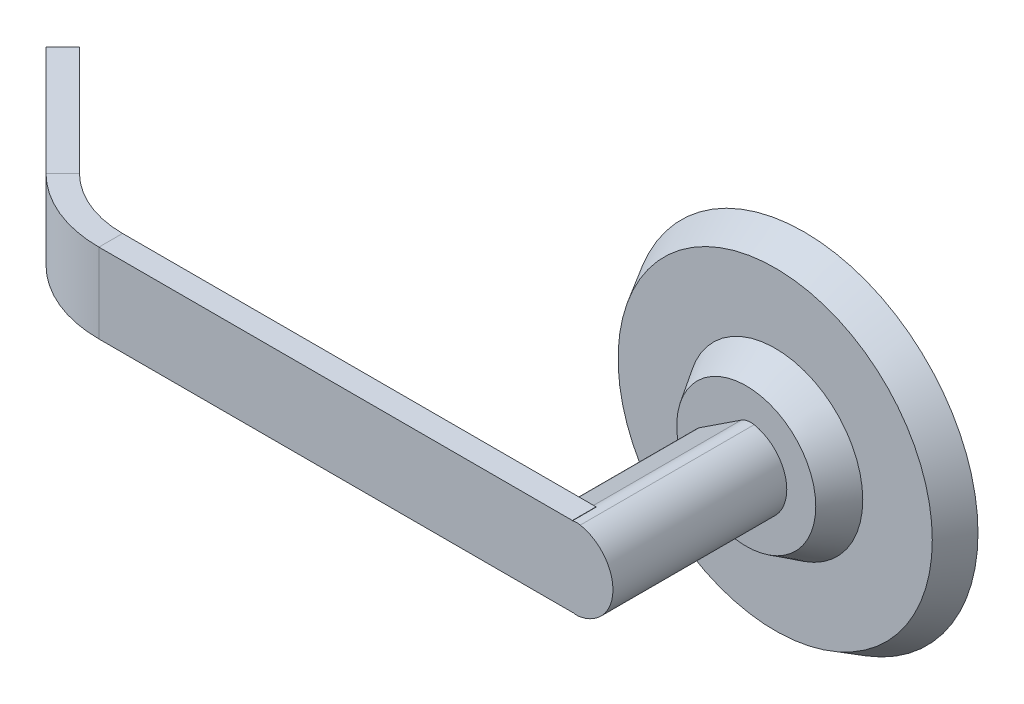
ISO-10303-21;
HEADER;
FILE_DESCRIPTION(('STEP AP214'),'2;1');
FILE_NAME('part.step','',(''),(''),'','','');
FILE_SCHEMA(('AUTOMOTIVE_DESIGN { 1 0 10303 214 1 1 1 1 }'));
ENDSEC;
DATA;
#1=APPLICATION_CONTEXT('core data for automotive mechanical design processes');
#2=APPLICATION_PROTOCOL_DEFINITION('international standard','automotive_design',2000,#1);
#3=PRODUCT_CONTEXT('',#1,'mechanical');
#4=PRODUCT('Part','Part','',(#3));
#5=PRODUCT_RELATED_PRODUCT_CATEGORY('part','',(#4));
#6=PRODUCT_DEFINITION_FORMATION('','',#4);
#7=PRODUCT_DEFINITION_CONTEXT('part definition',#1,'design');
#8=PRODUCT_DEFINITION('design','',#6,#7);
#9=PRODUCT_DEFINITION_SHAPE('','',#8);
#10=(LENGTH_UNIT() NAMED_UNIT(*) SI_UNIT(.MILLI.,.METRE.));
#11=(NAMED_UNIT(*) PLANE_ANGLE_UNIT() SI_UNIT($,.RADIAN.));
#12=(NAMED_UNIT(*) SI_UNIT($,.STERADIAN.) SOLID_ANGLE_UNIT());
#13=UNCERTAINTY_MEASURE_WITH_UNIT(LENGTH_MEASURE(1.E-05),#10,'distance_accuracy_value','');
#14=(GEOMETRIC_REPRESENTATION_CONTEXT(3) GLOBAL_UNCERTAINTY_ASSIGNED_CONTEXT((#13)) GLOBAL_UNIT_ASSIGNED_CONTEXT((#10,
#11,#12)) REPRESENTATION_CONTEXT('',''));
#15=CARTESIAN_POINT('',(0.,0.,0.));
#16=DIRECTION('',(0.,0.,1.));
#17=DIRECTION('',(1.,0.,0.));
#18=AXIS2_PLACEMENT_3D('',#15,#16,#17);
#19=CARTESIAN_POINT('',(-8.89,0.,38.1));
#20=DIRECTION('',(0.,0.,-1.));
#21=DIRECTION('',(-1.,0.,0.));
#22=AXIS2_PLACEMENT_3D('',#19,#20,#21);
#23=CYLINDRICAL_SURFACE('',#22,2.54);
#24=DIRECTION('',(0.,0.,-1.));
#25=VECTOR('',#24,1.);
#26=CARTESIAN_POINT('',(-10.2861581196911,-2.12187240540536,38.1));
#27=LINE('',#26,#25);
#28=CARTESIAN_POINT('',(-10.2861581196911,-2.12187240540536,32.9143260542168));
#29=VERTEX_POINT('',#28);
#30=CARTESIAN_POINT('',(-10.2861581196911,-2.12187240540536,0.));
#31=VERTEX_POINT('',#30);
#32=EDGE_CURVE('E293',#29,#31,#27,.T.);
#33=ORIENTED_EDGE('',*,*,#32,.F.);
#34=CARTESIAN_POINT('',(-8.89,0.,32.9143260542168));
#35=DIRECTION('',(0.,0.,1.));
#36=DIRECTION('',(1.,0.,0.));
#37=AXIS2_PLACEMENT_3D('',#34,#35,#36);
#38=CIRCLE('',#37,2.54);
#39=CARTESIAN_POINT('',(-10.2861581196911,2.12187240540536,32.9143260542168));
#40=VERTEX_POINT('',#39);
#41=EDGE_CURVE('E264',#29,#40,#38,.F.);
#42=ORIENTED_EDGE('',*,*,#41,.T.);
#43=DIRECTION('',(0.,0.,-1.));
#44=VECTOR('',#43,1.);
#45=CARTESIAN_POINT('',(-10.2861581196911,2.12187240540536,38.1));
#46=LINE('',#45,#44);
#47=CARTESIAN_POINT('',(-10.2861581196911,2.12187240540536,0.));
#48=VERTEX_POINT('',#47);
#49=EDGE_CURVE('E278',#40,#48,#46,.T.);
#50=ORIENTED_EDGE('',*,*,#49,.T.);
#51=CARTESIAN_POINT('',(-8.89,0.,0.));
#52=DIRECTION('',(0.,0.,-1.));
#53=DIRECTION('',(-1.,0.,0.));
#54=AXIS2_PLACEMENT_3D('',#51,#52,#53);
#55=CIRCLE('',#54,2.54);
#56=EDGE_CURVE('E270',#31,#48,#55,.T.);
#57=ORIENTED_EDGE('',*,*,#56,.F.);
#58=EDGE_LOOP('',(#33,#42,#50,#57));
#59=FACE_BOUND('',#58,.T.);
#60=ADVANCED_FACE('F49',(#59),#23,.T.);
#61=CARTESIAN_POINT('',(-10.2861581196911,-2.12187240540536,38.1));
#62=DIRECTION('',(0.549668551059475,0.835382836773761,0.));
#63=DIRECTION('',(-0.835382836773761,0.549668551059475,0.));
#64=AXIS2_PLACEMENT_3D('',#61,#62,#63);
#65=PLANE('',#64);
#66=DIRECTION('',(0.835382836773761,-0.549668551059475,0.));
#67=VECTOR('',#66,1.);
#68=CARTESIAN_POINT('',(-10.2861581196911,-2.12187240540536,32.9143260542168));
#69=LINE('',#68,#67);
#70=CARTESIAN_POINT('',(-1.10192803762914,-8.16494896812268,32.9143260542168));
#71=VERTEX_POINT('',#70);
#72=EDGE_CURVE('E64',#29,#71,#69,.T.);
#73=ORIENTED_EDGE('',*,*,#72,.F.);
#74=ORIENTED_EDGE('',*,*,#32,.T.);
#75=DIRECTION('',(0.835382836773761,-0.549668551059475,0.));
#76=VECTOR('',#75,1.);
#77=CARTESIAN_POINT('',(-10.2861581196911,-2.12187240540536,0.));
#78=LINE('',#77,#76);
#79=CARTESIAN_POINT('',(-1.10192803762914,-8.16494896812268,0.));
#80=VERTEX_POINT('',#79);
#81=EDGE_CURVE('E273',#31,#80,#78,.T.);
#82=ORIENTED_EDGE('',*,*,#81,.T.);
#83=DIRECTION('',(0.,0.,-1.));
#84=VECTOR('',#83,1.);
#85=CARTESIAN_POINT('',(-1.10192803762914,-8.16494896812268,38.1));
#86=LINE('',#85,#84);
#87=EDGE_CURVE('E296',#71,#80,#86,.T.);
#88=ORIENTED_EDGE('',*,*,#87,.F.);
#89=EDGE_LOOP('',(#73,#74,#82,#88));
#90=FACE_BOUND('',#89,.T.);
#91=ADVANCED_FACE('F331',(#90),#65,.F.);
#92=CARTESIAN_POINT('',(-1.10192803762914,8.16494896812268,38.1));
#93=DIRECTION('',(0.549668551059475,-0.835382836773761,0.));
#94=DIRECTION('',(0.835382836773761,0.549668551059475,0.));
#95=AXIS2_PLACEMENT_3D('',#92,#93,#94);
#96=PLANE('',#95);
#97=DIRECTION('',(-0.835382836773761,-0.549668551059475,0.));
#98=VECTOR('',#97,1.);
#99=CARTESIAN_POINT('',(-1.10192803762914,8.16494896812268,32.9143260542168));
#100=LINE('',#99,#98);
#101=CARTESIAN_POINT('',(-1.10192803762914,8.16494896812268,32.9143260542168));
#102=VERTEX_POINT('',#101);
#103=EDGE_CURVE('E13',#102,#40,#100,.T.);
#104=ORIENTED_EDGE('',*,*,#103,.F.);
#105=DIRECTION('',(0.,0.,-1.));
#106=VECTOR('',#105,1.);
#107=CARTESIAN_POINT('',(-1.10192803762914,8.16494896812268,38.1));
#108=LINE('',#107,#106);
#109=CARTESIAN_POINT('',(-1.10192803762914,8.16494896812268,0.));
#110=VERTEX_POINT('',#109);
#111=EDGE_CURVE('E304',#102,#110,#108,.T.);
#112=ORIENTED_EDGE('',*,*,#111,.T.);
#113=DIRECTION('',(-0.835382836773762,-0.549668551059476,0.));
#114=VECTOR('',#113,1.);
#115=CARTESIAN_POINT('',(-1.10192803762914,8.16494896812268,0.));
#116=LINE('',#115,#114);
#117=EDGE_CURVE('E281',#110,#48,#116,.T.);
#118=ORIENTED_EDGE('',*,*,#117,.T.);
#119=ORIENTED_EDGE('',*,*,#49,.F.);
#120=EDGE_LOOP('',(#104,#112,#118,#119));
#121=FACE_BOUND('',#120,.T.);
#122=ADVANCED_FACE('F328',(#121),#96,.F.);
#123=CARTESIAN_POINT('',(15.24,0.,0.));
#124=DIRECTION('',(0.,0.,1.));
#125=DIRECTION('',(1.,0.,0.));
#126=AXIS2_PLACEMENT_3D('',#123,#124,#125);
#127=PLANE('',#126);
#128=CARTESIAN_POINT('',(0.,0.,0.));
#129=DIRECTION('',(0.,0.,1.));
#130=DIRECTION('',(1.,0.,0.));
#131=AXIS2_PLACEMENT_3D('',#128,#129,#130);
#132=CIRCLE('',#131,15.24);
#133=CARTESIAN_POINT('',(15.24,0.,0.));
#134=VERTEX_POINT('',#133);
#135=EDGE_CURVE('E295',#134,#134,#132,.T.);
#136=ORIENTED_EDGE('',*,*,#135,.T.);
#137=EDGE_LOOP('',(#136));
#138=FACE_BOUND('',#137,.T.);
#139=ORIENTED_EDGE('',*,*,#81,.F.);
#140=ORIENTED_EDGE('',*,*,#56,.T.);
#141=ORIENTED_EDGE('',*,*,#117,.F.);
#142=CARTESIAN_POINT('',(0.992309141907463,4.98214036001465,0.));
#143=DIRECTION('',(0.,0.,-1.));
#144=DIRECTION('',(-1.,0.,0.));
#145=AXIS2_PLACEMENT_3D('',#142,#143,#144);
#146=CIRCLE('',#145,3.81);
#147=CARTESIAN_POINT('',(1.73654099833806,8.71874563002563,0.));
#148=VERTEX_POINT('',#147);
#149=EDGE_CURVE('E284',#110,#148,#146,.T.);
#150=ORIENTED_EDGE('',*,*,#149,.T.);
#151=CARTESIAN_POINT('',(0.,0.,0.));
#152=DIRECTION('',(0.,0.,-1.));
#153=DIRECTION('',(-1.,0.,0.));
#154=AXIS2_PLACEMENT_3D('',#151,#152,#153);
#155=CIRCLE('',#154,8.89);
#156=CARTESIAN_POINT('',(1.73654099833806,-8.71874563002563,0.));
#157=VERTEX_POINT('',#156);
#158=EDGE_CURVE('E286',#148,#157,#155,.T.);
#159=ORIENTED_EDGE('',*,*,#158,.T.);
#160=CARTESIAN_POINT('',(0.992309141907464,-4.98214036001465,0.));
#161=DIRECTION('',(0.,0.,1.));
#162=DIRECTION('',(1.,0.,0.));
#163=AXIS2_PLACEMENT_3D('',#160,#161,#162);
#164=CIRCLE('',#163,3.81);
#165=EDGE_CURVE('E288',#80,#157,#164,.T.);
#166=ORIENTED_EDGE('',*,*,#165,.F.);
#167=EDGE_LOOP('',(#139,#140,#141,#150,#159,#166));
#168=FACE_BOUND('',#167,.T.);
#169=ADVANCED_FACE('F51',(#138,#168),#127,.T.);
#170=CARTESIAN_POINT('',(0.,0.,-12.7));
#171=DIRECTION('',(0.,0.,-1.));
#172=DIRECTION('',(-1.,0.,0.));
#173=AXIS2_PLACEMENT_3D('',#170,#171,#172);
#174=PLANE('',#173);
#175=CARTESIAN_POINT('',(0.,0.,-12.7));
#176=DIRECTION('',(0.,0.,1.));
#177=DIRECTION('',(1.,0.,0.));
#178=AXIS2_PLACEMENT_3D('',#175,#176,#177);
#179=CIRCLE('',#178,38.1);
#180=CARTESIAN_POINT('',(38.1,0.,-12.7));
#181=VERTEX_POINT('',#180);
#182=EDGE_CURVE('E57',#181,#181,#179,.T.);
#183=ORIENTED_EDGE('',*,*,#182,.F.);
#184=EDGE_LOOP('',(#183));
#185=FACE_BOUND('',#184,.T.);
#186=ADVANCED_FACE('F320',(#185),#174,.T.);
#187=CARTESIAN_POINT('',(0.,0.,-6.35));
#188=DIRECTION('',(0.,0.,-1.));
#189=DIRECTION('',(-1.,0.,0.));
#190=AXIS2_PLACEMENT_3D('',#187,#188,#189);
#191=CONICAL_SURFACE('',#190,34.4338257906459,0.523598775598297);
#192=ORIENTED_EDGE('',*,*,#182,.T.);
#193=EDGE_LOOP('',(#192));
#194=FACE_BOUND('',#193,.T.);
#195=CARTESIAN_POINT('',(0.,0.,-6.35));
#196=DIRECTION('',(0.,0.,1.));
#197=DIRECTION('',(1.,0.,0.));
#198=AXIS2_PLACEMENT_3D('',#195,#196,#197);
#199=CIRCLE('',#198,34.4338257906459);
#200=CARTESIAN_POINT('',(34.4338257906459,0.,-6.35));
#201=VERTEX_POINT('',#200);
#202=EDGE_CURVE('E312',#201,#201,#199,.T.);
#203=ORIENTED_EDGE('',*,*,#202,.F.);
#204=EDGE_LOOP('',(#203));
#205=FACE_BOUND('',#204,.T.);
#206=ADVANCED_FACE('F317',(#194,#205),#191,.T.);
#207=CARTESIAN_POINT('',(34.4338257906459,0.,-6.35));
#208=DIRECTION('',(0.,0.,1.));
#209=DIRECTION('',(1.,0.,0.));
#210=AXIS2_PLACEMENT_3D('',#207,#208,#209);
#211=PLANE('',#210);
#212=ORIENTED_EDGE('',*,*,#202,.T.);
#213=EDGE_LOOP('',(#212));
#214=FACE_BOUND('',#213,.T.);
#215=CARTESIAN_POINT('',(0.,0.,-6.35));
#216=DIRECTION('',(0.,0.,1.));
#217=DIRECTION('',(1.,0.,0.));
#218=AXIS2_PLACEMENT_3D('',#215,#216,#217);
#219=CIRCLE('',#218,19.1938257906459);
#220=CARTESIAN_POINT('',(19.1938257906459,0.,-6.35));
#221=VERTEX_POINT('',#220);
#222=EDGE_CURVE('E309',#221,#221,#219,.T.);
#223=ORIENTED_EDGE('',*,*,#222,.F.);
#224=EDGE_LOOP('',(#223));
#225=FACE_BOUND('',#224,.T.);
#226=ADVANCED_FACE('F326',(#214,#225),#211,.T.);
#227=CARTESIAN_POINT('',(0.,0.,0.));
#228=DIRECTION('',(0.,0.,-1.));
#229=DIRECTION('',(-1.,0.,0.));
#230=AXIS2_PLACEMENT_3D('',#227,#228,#229);
#231=CONICAL_SURFACE('',#230,15.24,0.556907448621021);
#232=ORIENTED_EDGE('',*,*,#222,.T.);
#233=EDGE_LOOP('',(#232));
#234=FACE_BOUND('',#233,.T.);
#235=ORIENTED_EDGE('',*,*,#135,.F.);
#236=EDGE_LOOP('',(#235));
#237=FACE_BOUND('',#236,.T.);
#238=ADVANCED_FACE('F341',(#234,#237),#231,.T.);
#239=CARTESIAN_POINT('',(0.992309141907464,-4.98214036001465,38.1));
#240=DIRECTION('',(0.,0.,-1.));
#241=DIRECTION('',(-1.,0.,0.));
#242=AXIS2_PLACEMENT_3D('',#239,#240,#241);
#243=CYLINDRICAL_SURFACE('',#242,3.81);
#244=CARTESIAN_POINT('',(0.992309141907464,-4.98214036001465,38.1));
#245=DIRECTION('',(0.,0.,1.));
#246=DIRECTION('',(1.,0.,0.));
#247=AXIS2_PLACEMENT_3D('',#244,#245,#246);
#248=CIRCLE('',#247,3.81);
#249=CARTESIAN_POINT('',(0.,-8.66064855857651,38.1));
#250=VERTEX_POINT('',#249);
#251=CARTESIAN_POINT('',(1.73654099833806,-8.71874563002563,38.1));
#252=VERTEX_POINT('',#251);
#253=EDGE_CURVE('E276',#250,#252,#248,.T.);
#254=ORIENTED_EDGE('',*,*,#253,.F.);
#255=DIRECTION('',(0.,0.,-1.));
#256=VECTOR('',#255,1.);
#257=CARTESIAN_POINT('',(0.,-8.66064855857651,38.1));
#258=LINE('',#257,#256);
#259=CARTESIAN_POINT('',(0.,-8.66064855857651,32.9143260542168));
#260=VERTEX_POINT('',#259);
#261=EDGE_CURVE('E72',#250,#260,#258,.T.);
#262=ORIENTED_EDGE('',*,*,#261,.T.);
#263=CARTESIAN_POINT('',(0.992309141907464,-4.98214036001465,32.9143260542168));
#264=DIRECTION('',(0.,0.,1.));
#265=DIRECTION('',(1.,0.,0.));
#266=AXIS2_PLACEMENT_3D('',#263,#264,#265);
#267=CIRCLE('',#266,3.81);
#268=EDGE_CURVE('E268',#71,#260,#267,.T.);
#269=ORIENTED_EDGE('',*,*,#268,.F.);
#270=ORIENTED_EDGE('',*,*,#87,.T.);
#271=ORIENTED_EDGE('',*,*,#165,.T.);
#272=DIRECTION('',(0.,0.,-1.));
#273=VECTOR('',#272,1.);
#274=CARTESIAN_POINT('',(1.73654099833806,-8.71874563002563,38.1));
#275=LINE('',#274,#273);
#276=EDGE_CURVE('E298',#252,#157,#275,.T.);
#277=ORIENTED_EDGE('',*,*,#276,.F.);
#278=EDGE_LOOP('',(#254,#262,#269,#270,#271,#277));
#279=FACE_BOUND('',#278,.T.);
#280=ADVANCED_FACE('F344',(#279),#243,.T.);
#281=CARTESIAN_POINT('',(0.,0.,38.1));
#282=DIRECTION('',(0.,0.,-1.));
#283=DIRECTION('',(-1.,0.,0.));
#284=AXIS2_PLACEMENT_3D('',#281,#282,#283);
#285=CYLINDRICAL_SURFACE('',#284,8.89);
#286=ORIENTED_EDGE('',*,*,#158,.F.);
#287=DIRECTION('',(0.,0.,-1.));
#288=VECTOR('',#287,1.);
#289=CARTESIAN_POINT('',(1.73654099833806,8.71874563002563,38.1));
#290=LINE('',#289,#288);
#291=CARTESIAN_POINT('',(1.73654099833806,8.71874563002563,38.1));
#292=VERTEX_POINT('',#291);
#293=EDGE_CURVE('E301',#292,#148,#290,.T.);
#294=ORIENTED_EDGE('',*,*,#293,.F.);
#295=CARTESIAN_POINT('',(0.,0.,38.1));
#296=DIRECTION('',(0.,0.,-1.));
#297=DIRECTION('',(-1.,0.,0.));
#298=AXIS2_PLACEMENT_3D('',#295,#296,#297);
#299=CIRCLE('',#298,8.89);
#300=EDGE_CURVE('E272',#292,#252,#299,.T.);
#301=ORIENTED_EDGE('',*,*,#300,.T.);
#302=ORIENTED_EDGE('',*,*,#276,.T.);
#303=EDGE_LOOP('',(#286,#294,#301,#302));
#304=FACE_BOUND('',#303,.T.);
#305=ADVANCED_FACE('F370',(#304),#285,.T.);
#306=CARTESIAN_POINT('',(0.992309141907463,4.98214036001465,38.1));
#307=DIRECTION('',(0.,0.,-1.));
#308=DIRECTION('',(-1.,0.,0.));
#309=AXIS2_PLACEMENT_3D('',#306,#307,#308);
#310=CYLINDRICAL_SURFACE('',#309,3.81);
#311=DIRECTION('',(0.,0.,-1.));
#312=VECTOR('',#311,1.);
#313=CARTESIAN_POINT('',(0.,8.66064855857651,38.1));
#314=LINE('',#313,#312);
#315=CARTESIAN_POINT('',(0.,8.66064855857651,38.1));
#316=VERTEX_POINT('',#315);
#317=CARTESIAN_POINT('',(0.,8.66064855857651,32.9143260542168));
#318=VERTEX_POINT('',#317);
#319=EDGE_CURVE('E259',#316,#318,#314,.T.);
#320=ORIENTED_EDGE('',*,*,#319,.F.);
#321=CARTESIAN_POINT('',(0.992309141907463,4.98214036001465,38.1));
#322=DIRECTION('',(0.,0.,-1.));
#323=DIRECTION('',(-1.,0.,0.));
#324=AXIS2_PLACEMENT_3D('',#321,#322,#323);
#325=CIRCLE('',#324,3.81);
#326=EDGE_CURVE('E172',#316,#292,#325,.T.);
#327=ORIENTED_EDGE('',*,*,#326,.T.);
#328=ORIENTED_EDGE('',*,*,#293,.T.);
#329=ORIENTED_EDGE('',*,*,#149,.F.);
#330=ORIENTED_EDGE('',*,*,#111,.F.);
#331=CARTESIAN_POINT('',(0.992309141907463,4.98214036001465,32.9143260542168));
#332=DIRECTION('',(0.,0.,1.));
#333=DIRECTION('',(1.,0.,0.));
#334=AXIS2_PLACEMENT_3D('',#331,#332,#333);
#335=CIRCLE('',#334,3.81);
#336=EDGE_CURVE('E262',#102,#318,#335,.F.);
#337=ORIENTED_EDGE('',*,*,#336,.T.);
#338=EDGE_LOOP('',(#320,#327,#328,#329,#330,#337));
#339=FACE_BOUND('',#338,.T.);
#340=ADVANCED_FACE('F365',(#339),#310,.T.);
#341=CARTESIAN_POINT('',(-8.89,0.,38.1));
#342=DIRECTION('',(0.,0.,-1.));
#343=DIRECTION('',(-1.,0.,0.));
#344=AXIS2_PLACEMENT_3D('',#341,#342,#343);
#345=PLANE('',#344);
#346=DIRECTION('',(0.,-1.,0.));
#347=VECTOR('',#346,1.);
#348=CARTESIAN_POINT('',(0.,8.71874563002563,38.1));
#349=LINE('',#348,#347);
#350=CARTESIAN_POINT('',(0.,-8.71874563002563,38.1));
#351=VERTEX_POINT('',#350);
#352=EDGE_CURVE('E176',#250,#351,#349,.T.);
#353=ORIENTED_EDGE('',*,*,#352,.F.);
#354=ORIENTED_EDGE('',*,*,#253,.T.);
#355=ORIENTED_EDGE('',*,*,#300,.F.);
#356=ORIENTED_EDGE('',*,*,#326,.F.);
#357=CARTESIAN_POINT('',(0.,8.71874563002563,38.1));
#358=VERTEX_POINT('',#357);
#359=EDGE_CURVE('E164',#358,#316,#349,.T.);
#360=ORIENTED_EDGE('',*,*,#359,.F.);
#361=DIRECTION('',(-1.,0.,0.));
#362=VECTOR('',#361,1.);
#363=CARTESIAN_POINT('',(0.,8.71874563002563,38.1));
#364=LINE('',#363,#362);
#365=CARTESIAN_POINT('',(-103.778975515723,8.71874563002563,38.1));
#366=VERTEX_POINT('',#365);
#367=EDGE_CURVE('E170',#358,#366,#364,.T.);
#368=ORIENTED_EDGE('',*,*,#367,.T.);
#369=DIRECTION('',(0.,-1.,0.));
#370=VECTOR('',#369,1.);
#371=CARTESIAN_POINT('',(-103.778975515723,8.71874563002563,38.1));
#372=LINE('',#371,#370);
#373=CARTESIAN_POINT('',(-103.778975515723,-8.71874563002563,38.1));
#374=VERTEX_POINT('',#373);
#375=EDGE_CURVE('E193',#366,#374,#372,.T.);
#376=ORIENTED_EDGE('',*,*,#375,.T.);
#377=DIRECTION('',(-1.,0.,0.));
#378=VECTOR('',#377,1.);
#379=CARTESIAN_POINT('',(0.,-8.71874563002563,38.1));
#380=LINE('',#379,#378);
#381=EDGE_CURVE('E195',#351,#374,#380,.T.);
#382=ORIENTED_EDGE('',*,*,#381,.F.);
#383=EDGE_LOOP('',(#353,#354,#355,#356,#360,#368,#376,#382));
#384=FACE_BOUND('',#383,.T.);
#385=ADVANCED_FACE('F167',(#384),#345,.F.);
#386=CARTESIAN_POINT('',(0.,8.71874563002563,32.9143260542168));
#387=DIRECTION('',(0.,0.,1.));
#388=DIRECTION('',(1.,0.,0.));
#389=AXIS2_PLACEMENT_3D('',#386,#387,#388);
#390=PLANE('',#389);
#391=ORIENTED_EDGE('',*,*,#72,.T.);
#392=ORIENTED_EDGE('',*,*,#268,.T.);
#393=DIRECTION('',(0.,1.,0.));
#394=VECTOR('',#393,1.);
#395=CARTESIAN_POINT('',(0.,8.71874563002563,32.9143260542168));
#396=LINE('',#395,#394);
#397=CARTESIAN_POINT('',(0.,-8.71874563002563,32.9143260542168));
#398=VERTEX_POINT('',#397);
#399=EDGE_CURVE('E186',#398,#260,#396,.T.);
#400=ORIENTED_EDGE('',*,*,#399,.F.);
#401=DIRECTION('',(-1.,0.,0.));
#402=VECTOR('',#401,1.);
#403=CARTESIAN_POINT('',(0.,-8.71874563002563,32.9143260542168));
#404=LINE('',#403,#402);
#405=CARTESIAN_POINT('',(-103.778975515723,-8.71874563002563,32.9143260542169));
#406=VERTEX_POINT('',#405);
#407=EDGE_CURVE('E224',#398,#406,#404,.T.);
#408=ORIENTED_EDGE('',*,*,#407,.T.);
#409=DIRECTION('',(0.,1.,0.));
#410=VECTOR('',#409,1.);
#411=CARTESIAN_POINT('',(-103.778975515723,8.71874563002563,32.9143260542169));
#412=LINE('',#411,#410);
#413=CARTESIAN_POINT('',(-103.778975515723,8.71874563002563,32.9143260542169));
#414=VERTEX_POINT('',#413);
#415=EDGE_CURVE('E227',#406,#414,#412,.T.);
#416=ORIENTED_EDGE('',*,*,#415,.T.);
#417=DIRECTION('',(-1.,0.,0.));
#418=VECTOR('',#417,1.);
#419=CARTESIAN_POINT('',(0.,8.71874563002563,32.9143260542168));
#420=LINE('',#419,#418);
#421=CARTESIAN_POINT('',(0.,8.71874563002563,32.9143260542168));
#422=VERTEX_POINT('',#421);
#423=EDGE_CURVE('E243',#422,#414,#420,.T.);
#424=ORIENTED_EDGE('',*,*,#423,.F.);
#425=EDGE_CURVE('E182',#318,#422,#396,.T.);
#426=ORIENTED_EDGE('',*,*,#425,.F.);
#427=ORIENTED_EDGE('',*,*,#336,.F.);
#428=ORIENTED_EDGE('',*,*,#103,.T.);
#429=ORIENTED_EDGE('',*,*,#41,.F.);
#430=EDGE_LOOP('',(#391,#392,#400,#408,#416,#424,#426,#427,#428,#429));
#431=FACE_BOUND('',#430,.T.);
#432=ADVANCED_FACE('F373',(#431),#390,.F.);
#433=CARTESIAN_POINT('',(0.,0.,0.));
#434=DIRECTION('',(1.,0.,0.));
#435=DIRECTION('',(0.,0.,-1.));
#436=AXIS2_PLACEMENT_3D('',#433,#434,#435);
#437=PLANE('',#436);
#438=ORIENTED_EDGE('',*,*,#261,.F.);
#439=ORIENTED_EDGE('',*,*,#352,.T.);
#440=DIRECTION('',(0.,0.,-1.));
#441=VECTOR('',#440,1.);
#442=CARTESIAN_POINT('',(0.,-8.71874563002563,38.1));
#443=LINE('',#442,#441);
#444=EDGE_CURVE('E175',#351,#398,#443,.T.);
#445=ORIENTED_EDGE('',*,*,#444,.T.);
#446=ORIENTED_EDGE('',*,*,#399,.T.);
#447=EDGE_LOOP('',(#438,#439,#445,#446));
#448=FACE_BOUND('',#447,.T.);
#449=ADVANCED_FACE('F392',(#448),#437,.T.);
#450=ORIENTED_EDGE('',*,*,#359,.T.);
#451=ORIENTED_EDGE('',*,*,#319,.T.);
#452=ORIENTED_EDGE('',*,*,#425,.T.);
#453=DIRECTION('',(0.,0.,1.));
#454=VECTOR('',#453,1.);
#455=CARTESIAN_POINT('',(0.,8.71874563002563,38.1));
#456=LINE('',#455,#454);
#457=EDGE_CURVE('E179',#422,#358,#456,.T.);
#458=ORIENTED_EDGE('',*,*,#457,.T.);
#459=EDGE_LOOP('',(#450,#451,#452,#458));
#460=FACE_BOUND('',#459,.T.);
#461=ADVANCED_FACE('F180',(#460),#437,.T.);
#462=CARTESIAN_POINT('',(-120.623540666577,0.,-21.0310891537982));
#463=DIRECTION('',(0.707106781186548,0.,0.707106781186547));
#464=DIRECTION('',(0.707106781186547,0.,-0.707106781186548));
#465=AXIS2_PLACEMENT_3D('',#462,#463,#464);
#466=PLANE('',#465);
#467=DIRECTION('',(0.,-1.,0.));
#468=VECTOR('',#467,1.);
#469=CARTESIAN_POINT('',(-147.564309029785,8.71874563002563,5.90967920940926));
#470=LINE('',#469,#468);
#471=CARTESIAN_POINT('',(-147.564309029785,8.71874563002563,5.90967920940926));
#472=VERTEX_POINT('',#471);
#473=CARTESIAN_POINT('',(-147.564309029785,-8.71874563002563,5.90967920940926));
#474=VERTEX_POINT('',#473);
#475=EDGE_CURVE('E209',#472,#474,#470,.T.);
#476=ORIENTED_EDGE('',*,*,#475,.F.);
#477=DIRECTION('',(-0.707106781186547,0.,0.707106781186548));
#478=VECTOR('',#477,1.);
#479=CARTESIAN_POINT('',(-147.564309029785,8.71874563002563,5.90967920940926));
#480=LINE('',#479,#478);
#481=CARTESIAN_POINT('',(-143.897483817699,8.71874563002563,2.24285399732359));
#482=VERTEX_POINT('',#481);
#483=EDGE_CURVE('E253',#482,#472,#480,.T.);
#484=ORIENTED_EDGE('',*,*,#483,.F.);
#485=DIRECTION('',(0.,1.,0.));
#486=VECTOR('',#485,1.);
#487=CARTESIAN_POINT('',(-143.897483817699,8.71874563002563,2.24285399732359));
#488=LINE('',#487,#486);
#489=CARTESIAN_POINT('',(-143.897483817699,-8.71874563002563,2.24285399732359));
#490=VERTEX_POINT('',#489);
#491=EDGE_CURVE('E238',#490,#482,#488,.T.);
#492=ORIENTED_EDGE('',*,*,#491,.F.);
#493=DIRECTION('',(0.707106781186547,0.,-0.707106781186548));
#494=VECTOR('',#493,1.);
#495=CARTESIAN_POINT('',(-147.564309029785,-8.71874563002563,5.90967920940926));
#496=LINE('',#495,#494);
#497=EDGE_CURVE('E215',#474,#490,#496,.T.);
#498=ORIENTED_EDGE('',*,*,#497,.F.);
#499=EDGE_LOOP('',(#476,#484,#492,#498));
#500=FACE_BOUND('',#499,.T.);
#501=ADVANCED_FACE('F400',(#500),#466,.F.);
#502=CARTESIAN_POINT('',(0.,-8.71874563002563,38.1));
#503=DIRECTION('',(0.,1.,0.));
#504=DIRECTION('',(0.,0.,1.));
#505=AXIS2_PLACEMENT_3D('',#502,#503,#504);
#506=PLANE('',#505);
#507=ORIENTED_EDGE('',*,*,#407,.F.);
#508=ORIENTED_EDGE('',*,*,#444,.F.);
#509=ORIENTED_EDGE('',*,*,#381,.T.);
#510=DIRECTION('',(0.,0.,-1.));
#511=VECTOR('',#510,1.);
#512=CARTESIAN_POINT('',(-103.778975515723,-8.71874563002563,38.1));
#513=LINE('',#512,#511);
#514=EDGE_CURVE('E221',#374,#406,#513,.T.);
#515=ORIENTED_EDGE('',*,*,#514,.T.);
#516=EDGE_LOOP('',(#507,#508,#509,#515));
#517=FACE_BOUND('',#516,.T.);
#518=ADVANCED_FACE('F390',(#517),#506,.F.);
#519=CARTESIAN_POINT('',(0.,8.71874563002563,38.1));
#520=DIRECTION('',(0.,-1.,0.));
#521=DIRECTION('',(0.,0.,-1.));
#522=AXIS2_PLACEMENT_3D('',#519,#520,#521);
#523=PLANE('',#522);
#524=DIRECTION('',(0.,0.,1.));
#525=VECTOR('',#524,1.);
#526=CARTESIAN_POINT('',(-103.778975515723,8.71874563002563,38.1));
#527=LINE('',#526,#525);
#528=EDGE_CURVE('E191',#414,#366,#527,.T.);
#529=ORIENTED_EDGE('',*,*,#528,.T.);
#530=ORIENTED_EDGE('',*,*,#367,.F.);
#531=ORIENTED_EDGE('',*,*,#457,.F.);
#532=ORIENTED_EDGE('',*,*,#423,.T.);
#533=EDGE_LOOP('',(#529,#530,#531,#532));
#534=FACE_BOUND('',#533,.T.);
#535=ADVANCED_FACE('F189',(#534),#523,.F.);
#536=CARTESIAN_POINT('',(-103.778975515723,0.,10.1071630271084));
#537=DIRECTION('',(0.,-1.,0.));
#538=DIRECTION('',(0.,0.,-1.));
#539=AXIS2_PLACEMENT_3D('',#536,#537,#538);
#540=CYLINDRICAL_SURFACE('',#539,27.9928369728916);
#541=CARTESIAN_POINT('',(-103.778975515723,-8.71874563002563,10.1071630271084));
#542=DIRECTION('',(0.,-1.,0.));
#543=DIRECTION('',(0.,0.,1.));
#544=AXIS2_PLACEMENT_3D('',#541,#542,#543);
#545=CIRCLE('',#544,27.9928369728916);
#546=CARTESIAN_POINT('',(-123.572900363905,-8.71874563002563,29.9010878752895));
#547=VERTEX_POINT('',#546);
#548=EDGE_CURVE('E202',#374,#547,#545,.T.);
#549=ORIENTED_EDGE('',*,*,#548,.F.);
#550=ORIENTED_EDGE('',*,*,#375,.F.);
#551=CARTESIAN_POINT('',(-103.778975515723,8.71874563002563,10.1071630271084));
#552=DIRECTION('',(0.,-1.,0.));
#553=DIRECTION('',(0.,0.,1.));
#554=AXIS2_PLACEMENT_3D('',#551,#552,#553);
#555=CIRCLE('',#554,27.9928369728916);
#556=CARTESIAN_POINT('',(-123.572900363905,8.71874563002563,29.9010878752895));
#557=VERTEX_POINT('',#556);
#558=EDGE_CURVE('E203',#366,#557,#555,.T.);
#559=ORIENTED_EDGE('',*,*,#558,.T.);
#560=DIRECTION('',(0.,-1.,0.));
#561=VECTOR('',#560,1.);
#562=CARTESIAN_POINT('',(-123.572900363905,8.71874563002563,29.9010878752895));
#563=LINE('',#562,#561);
#564=EDGE_CURVE('E199',#557,#547,#563,.T.);
#565=ORIENTED_EDGE('',*,*,#564,.T.);
#566=EDGE_LOOP('',(#549,#550,#559,#565));
#567=FACE_BOUND('',#566,.T.);
#568=ADVANCED_FACE('F384',(#567),#540,.T.);
#569=CARTESIAN_POINT('',(-103.778975515723,-8.71874563002563,38.1));
#570=DIRECTION('',(0.,1.,0.));
#571=DIRECTION('',(0.,0.,1.));
#572=AXIS2_PLACEMENT_3D('',#569,#570,#571);
#573=PLANE('',#572);
#574=CARTESIAN_POINT('',(-103.778975515723,-8.71874563002563,10.1071630271084));
#575=DIRECTION('',(0.,-1.,0.));
#576=DIRECTION('',(0.,0.,1.));
#577=AXIS2_PLACEMENT_3D('',#574,#575,#576);
#578=CIRCLE('',#577,22.8071630271084);
#579=CARTESIAN_POINT('',(-119.906075151819,-8.71874563002563,26.2342626632039));
#580=VERTEX_POINT('',#579);
#581=EDGE_CURVE('E230',#406,#580,#578,.T.);
#582=ORIENTED_EDGE('',*,*,#581,.F.);
#583=ORIENTED_EDGE('',*,*,#514,.F.);
#584=ORIENTED_EDGE('',*,*,#548,.T.);
#585=DIRECTION('',(0.70710678118655,0.,-0.707106781186545));
#586=VECTOR('',#585,1.);
#587=CARTESIAN_POINT('',(-123.572900363905,-8.71874563002563,29.9010878752895));
#588=LINE('',#587,#586);
#589=EDGE_CURVE('E206',#547,#580,#588,.T.);
#590=ORIENTED_EDGE('',*,*,#589,.T.);
#591=EDGE_LOOP('',(#582,#583,#584,#590));
#592=FACE_BOUND('',#591,.T.);
#593=ADVANCED_FACE('F431',(#592),#573,.F.);
#594=CARTESIAN_POINT('',(-103.778975515723,0.,10.1071630271084));
#595=DIRECTION('',(0.,-1.,0.));
#596=DIRECTION('',(0.,0.,-1.));
#597=AXIS2_PLACEMENT_3D('',#594,#595,#596);
#598=CYLINDRICAL_SURFACE('',#597,22.8071630271084);
#599=CARTESIAN_POINT('',(-103.778975515723,8.71874563002563,10.1071630271084));
#600=DIRECTION('',(0.,-1.,0.));
#601=DIRECTION('',(0.,0.,1.));
#602=AXIS2_PLACEMENT_3D('',#599,#600,#601);
#603=CIRCLE('',#602,22.8071630271084);
#604=CARTESIAN_POINT('',(-119.906075151819,8.71874563002563,26.2342626632039));
#605=VERTEX_POINT('',#604);
#606=EDGE_CURVE('E247',#414,#605,#603,.T.);
#607=ORIENTED_EDGE('',*,*,#606,.F.);
#608=ORIENTED_EDGE('',*,*,#415,.F.);
#609=ORIENTED_EDGE('',*,*,#581,.T.);
#610=DIRECTION('',(0.,1.,0.));
#611=VECTOR('',#610,1.);
#612=CARTESIAN_POINT('',(-119.906075151819,8.71874563002563,26.2342626632039));
#613=LINE('',#612,#611);
#614=EDGE_CURVE('E233',#580,#605,#613,.T.);
#615=ORIENTED_EDGE('',*,*,#614,.T.);
#616=EDGE_LOOP('',(#607,#608,#609,#615));
#617=FACE_BOUND('',#616,.T.);
#618=ADVANCED_FACE('F377',(#617),#598,.F.);
#619=CARTESIAN_POINT('',(-103.778975515723,8.71874563002563,38.1));
#620=DIRECTION('',(0.,-1.,0.));
#621=DIRECTION('',(0.,0.,-1.));
#622=AXIS2_PLACEMENT_3D('',#619,#620,#621);
#623=PLANE('',#622);
#624=DIRECTION('',(-0.70710678118655,0.,0.707106781186545));
#625=VECTOR('',#624,1.);
#626=CARTESIAN_POINT('',(-123.572900363905,8.71874563002563,29.9010878752895));
#627=LINE('',#626,#625);
#628=EDGE_CURVE('E218',#605,#557,#627,.T.);
#629=ORIENTED_EDGE('',*,*,#628,.T.);
#630=ORIENTED_EDGE('',*,*,#558,.F.);
#631=ORIENTED_EDGE('',*,*,#528,.F.);
#632=ORIENTED_EDGE('',*,*,#606,.T.);
#633=EDGE_LOOP('',(#629,#630,#631,#632));
#634=FACE_BOUND('',#633,.T.);
#635=ADVANCED_FACE('F380',(#634),#623,.F.);
#636=CARTESIAN_POINT('',(-123.572900363905,8.71874563002563,29.9010878752895));
#637=DIRECTION('',(0.707106781186547,0.,-0.707106781186548));
#638=DIRECTION('',(-0.707106781186548,0.,-0.707106781186547));
#639=AXIS2_PLACEMENT_3D('',#636,#637,#638);
#640=PLANE('',#639);
#641=DIRECTION('',(-0.707106781186548,0.,-0.707106781186547));
#642=VECTOR('',#641,1.);
#643=CARTESIAN_POINT('',(-123.572900363905,-8.71874563002563,29.9010878752895));
#644=LINE('',#643,#642);
#645=EDGE_CURVE('E211',#547,#474,#644,.T.);
#646=ORIENTED_EDGE('',*,*,#645,.F.);
#647=ORIENTED_EDGE('',*,*,#564,.F.);
#648=DIRECTION('',(-0.707106781186548,0.,-0.707106781186547));
#649=VECTOR('',#648,1.);
#650=CARTESIAN_POINT('',(-123.572900363905,8.71874563002563,29.9010878752895));
#651=LINE('',#650,#649);
#652=EDGE_CURVE('E212',#557,#472,#651,.T.);
#653=ORIENTED_EDGE('',*,*,#652,.T.);
#654=ORIENTED_EDGE('',*,*,#475,.T.);
#655=EDGE_LOOP('',(#646,#647,#653,#654));
#656=FACE_BOUND('',#655,.T.);
#657=ADVANCED_FACE('F427',(#656),#640,.F.);
#658=CARTESIAN_POINT('',(-123.572900363905,-8.71874563002563,29.9010878752895));
#659=DIRECTION('',(0.,1.,0.));
#660=DIRECTION('',(0.,0.,1.));
#661=AXIS2_PLACEMENT_3D('',#658,#659,#660);
#662=PLANE('',#661);
#663=DIRECTION('',(-0.707106781186548,0.,-0.707106781186547));
#664=VECTOR('',#663,1.);
#665=CARTESIAN_POINT('',(-119.906075151819,-8.71874563002563,26.2342626632038));
#666=LINE('',#665,#664);
#667=EDGE_CURVE('E235',#580,#490,#666,.T.);
#668=ORIENTED_EDGE('',*,*,#667,.F.);
#669=ORIENTED_EDGE('',*,*,#589,.F.);
#670=ORIENTED_EDGE('',*,*,#645,.T.);
#671=ORIENTED_EDGE('',*,*,#497,.T.);
#672=EDGE_LOOP('',(#668,#669,#670,#671));
#673=FACE_BOUND('',#672,.T.);
#674=ADVANCED_FACE('F411',(#673),#662,.F.);
#675=CARTESIAN_POINT('',(-119.906075151819,8.71874563002563,26.2342626632038));
#676=DIRECTION('',(-0.707106781186547,0.,0.707106781186548));
#677=DIRECTION('',(0.707106781186548,0.,0.707106781186547));
#678=AXIS2_PLACEMENT_3D('',#675,#676,#677);
#679=PLANE('',#678);
#680=DIRECTION('',(-0.707106781186548,0.,-0.707106781186547));
#681=VECTOR('',#680,1.);
#682=CARTESIAN_POINT('',(-119.906075151819,8.71874563002563,26.2342626632038));
#683=LINE('',#682,#681);
#684=EDGE_CURVE('E251',#605,#482,#683,.T.);
#685=ORIENTED_EDGE('',*,*,#684,.F.);
#686=ORIENTED_EDGE('',*,*,#614,.F.);
#687=ORIENTED_EDGE('',*,*,#667,.T.);
#688=ORIENTED_EDGE('',*,*,#491,.T.);
#689=EDGE_LOOP('',(#685,#686,#687,#688));
#690=FACE_BOUND('',#689,.T.);
#691=ADVANCED_FACE('F405',(#690),#679,.F.);
#692=CARTESIAN_POINT('',(-123.572900363905,8.71874563002563,29.9010878752895));
#693=DIRECTION('',(0.,-1.,0.));
#694=DIRECTION('',(0.,0.,-1.));
#695=AXIS2_PLACEMENT_3D('',#692,#693,#694);
#696=PLANE('',#695);
#697=ORIENTED_EDGE('',*,*,#483,.T.);
#698=ORIENTED_EDGE('',*,*,#652,.F.);
#699=ORIENTED_EDGE('',*,*,#628,.F.);
#700=ORIENTED_EDGE('',*,*,#684,.T.);
#701=EDGE_LOOP('',(#697,#698,#699,#700));
#702=FACE_BOUND('',#701,.T.);
#703=ADVANCED_FACE('F395',(#702),#696,.F.);
#704=CLOSED_SHELL('',(#60,#91,#122,#169,#186,#206,#226,#238,#280,#305,#340,#385,#432,#449,#461,
#501,#518,#535,#568,#593,#618,#635,#657,#674,#691,#703));
#705=MANIFOLD_SOLID_BREP('B2',#704);
#706=ADVANCED_BREP_SHAPE_REPRESENTATION('',(#18,#705),#14);
#707=SHAPE_DEFINITION_REPRESENTATION(#9,#706);
ENDSEC;
END-ISO-10303-21;
